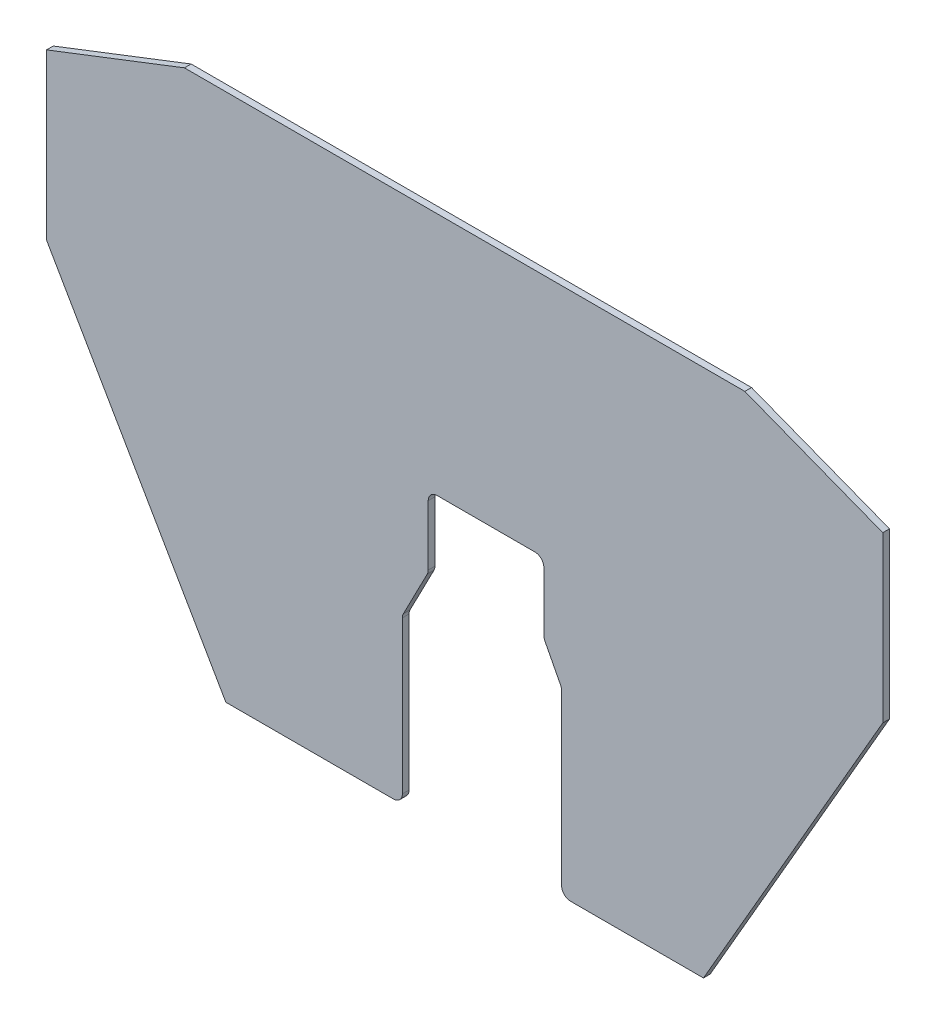
ISO-10303-21;
HEADER;
FILE_DESCRIPTION(('STEP AP214'),'2;1');
FILE_NAME('part.step','',(''),(''),'','','');
FILE_SCHEMA(('AUTOMOTIVE_DESIGN { 1 0 10303 214 1 1 1 1 }'));
ENDSEC;
DATA;
#1=APPLICATION_CONTEXT('core data for automotive mechanical design processes');
#2=APPLICATION_PROTOCOL_DEFINITION('international standard','automotive_design',2000,#1);
#3=PRODUCT_CONTEXT('',#1,'mechanical');
#4=PRODUCT('Part','Part','',(#3));
#5=PRODUCT_RELATED_PRODUCT_CATEGORY('part','',(#4));
#6=PRODUCT_DEFINITION_FORMATION('','',#4);
#7=PRODUCT_DEFINITION_CONTEXT('part definition',#1,'design');
#8=PRODUCT_DEFINITION('design','',#6,#7);
#9=PRODUCT_DEFINITION_SHAPE('','',#8);
#10=(LENGTH_UNIT() NAMED_UNIT(*) SI_UNIT(.MILLI.,.METRE.));
#11=(NAMED_UNIT(*) PLANE_ANGLE_UNIT() SI_UNIT($,.RADIAN.));
#12=(NAMED_UNIT(*) SI_UNIT($,.STERADIAN.) SOLID_ANGLE_UNIT());
#13=UNCERTAINTY_MEASURE_WITH_UNIT(LENGTH_MEASURE(1.E-05),#10,'distance_accuracy_value','');
#14=(GEOMETRIC_REPRESENTATION_CONTEXT(3) GLOBAL_UNCERTAINTY_ASSIGNED_CONTEXT((#13)) GLOBAL_UNIT_ASSIGNED_CONTEXT((#10,
#11,#12)) REPRESENTATION_CONTEXT('',''));
#15=CARTESIAN_POINT('',(0.,0.,0.));
#16=DIRECTION('',(0.,0.,1.));
#17=DIRECTION('',(1.,0.,0.));
#18=AXIS2_PLACEMENT_3D('',#15,#16,#17);
#19=CARTESIAN_POINT('',(-44.4499999999997,-171.615744817702,4.7752));
#20=DIRECTION('',(0.,1.,0.));
#21=DIRECTION('',(-1.,0.,0.));
#22=AXIS2_PLACEMENT_3D('',#19,#20,#21);
#23=PLANE('',#22);
#24=DIRECTION('',(1.,0.,0.));
#25=VECTOR('',#24,1.);
#26=CARTESIAN_POINT('',(-44.4499999999997,-171.615744817702,0.));
#27=LINE('',#26,#25);
#28=CARTESIAN_POINT('',(-170.467651581292,-171.615744817702,0.));
#29=VERTEX_POINT('',#28);
#30=CARTESIAN_POINT('',(-50.7999999999998,-171.615744817702,0.));
#31=VERTEX_POINT('',#30);
#32=EDGE_CURVE('E235',#29,#31,#27,.T.);
#33=ORIENTED_EDGE('',*,*,#32,.T.);
#34=DIRECTION('',(0.,0.,-1.));
#35=VECTOR('',#34,1.);
#36=CARTESIAN_POINT('',(-50.7999999999998,-171.615744817702,4.7752));
#37=LINE('',#36,#35);
#38=CARTESIAN_POINT('',(-50.7999999999998,-171.615744817702,4.7752));
#39=VERTEX_POINT('',#38);
#40=EDGE_CURVE('E343',#31,#39,#37,.F.);
#41=ORIENTED_EDGE('',*,*,#40,.T.);
#42=DIRECTION('',(1.,0.,0.));
#43=VECTOR('',#42,1.);
#44=CARTESIAN_POINT('',(-63.4999999999999,-171.615744817702,4.7752));
#45=LINE('',#44,#43);
#46=CARTESIAN_POINT('',(-170.467651581292,-171.615744817702,4.7752));
#47=VERTEX_POINT('',#46);
#48=EDGE_CURVE('E275',#47,#39,#45,.T.);
#49=ORIENTED_EDGE('',*,*,#48,.F.);
#50=DIRECTION('',(0.,0.,-1.));
#51=VECTOR('',#50,1.);
#52=CARTESIAN_POINT('',(-170.467651581292,-171.615744817702,4.7752));
#53=LINE('',#52,#51);
#54=EDGE_CURVE('E234',#47,#29,#53,.T.);
#55=ORIENTED_EDGE('',*,*,#54,.T.);
#56=EDGE_LOOP('',(#33,#41,#49,#55));
#57=FACE_BOUND('',#56,.T.);
#58=ADVANCED_FACE('F32',(#57),#23,.F.);
#59=CARTESIAN_POINT('',(-44.4499999999998,-54.8861606008071,4.7752));
#60=DIRECTION('',(-1.,0.,0.));
#61=DIRECTION('',(0.,-1.,0.));
#62=AXIS2_PLACEMENT_3D('',#59,#60,#61);
#63=PLANE('',#62);
#64=DIRECTION('',(0.,1.,0.));
#65=VECTOR('',#64,1.);
#66=CARTESIAN_POINT('',(-44.4499999999998,-54.8861606008071,0.));
#67=LINE('',#66,#65);
#68=CARTESIAN_POINT('',(-44.4499999999997,-165.265744817702,0.));
#69=VERTEX_POINT('',#68);
#70=CARTESIAN_POINT('',(-44.4499999999998,-56.4303886129366,0.));
#71=VERTEX_POINT('',#70);
#72=EDGE_CURVE('E238',#69,#71,#67,.T.);
#73=ORIENTED_EDGE('',*,*,#72,.T.);
#74=DIRECTION('',(0.,0.,-1.));
#75=VECTOR('',#74,1.);
#76=CARTESIAN_POINT('',(-44.4499999999998,-56.4303886129366,4.7752));
#77=LINE('',#76,#75);
#78=CARTESIAN_POINT('',(-44.4499999999998,-56.4303886129366,4.7752));
#79=VERTEX_POINT('',#78);
#80=EDGE_CURVE('E341',#71,#79,#77,.F.);
#81=ORIENTED_EDGE('',*,*,#80,.T.);
#82=DIRECTION('',(0.,1.,0.));
#83=VECTOR('',#82,1.);
#84=CARTESIAN_POINT('',(-44.4499999999998,-54.8861606008071,4.7752));
#85=LINE('',#84,#83);
#86=CARTESIAN_POINT('',(-44.4499999999997,-165.265744817702,4.7752));
#87=VERTEX_POINT('',#86);
#88=EDGE_CURVE('E374',#87,#79,#85,.T.);
#89=ORIENTED_EDGE('',*,*,#88,.F.);
#90=DIRECTION('',(0.,0.,-1.));
#91=VECTOR('',#90,1.);
#92=CARTESIAN_POINT('',(-44.4499999999997,-165.265744817702,4.7752));
#93=LINE('',#92,#91);
#94=EDGE_CURVE('E338',#87,#69,#93,.T.);
#95=ORIENTED_EDGE('',*,*,#94,.T.);
#96=EDGE_LOOP('',(#73,#81,#89,#95));
#97=FACE_BOUND('',#96,.T.);
#98=ADVANCED_FACE('F364',(#97),#63,.F.);
#99=CARTESIAN_POINT('',(-26.0104426662971,-19.215744817702,4.7752));
#100=DIRECTION('',(-0.888325926536994,0.45921351051792,0.));
#101=DIRECTION('',(-0.45921351051792,-0.888325926536994,0.));
#102=AXIS2_PLACEMENT_3D('',#99,#100,#101);
#103=PLANE('',#102);
#104=DIRECTION('',(0.45921351051792,0.888325926536994,0.));
#105=VECTOR('',#104,1.);
#106=CARTESIAN_POINT('',(-26.0104426662971,-19.215744817702,0.));
#107=LINE('',#106,#105);
#108=CARTESIAN_POINT('',(-43.7408696335097,-53.5143828211478,0.));
#109=VERTEX_POINT('',#108);
#110=CARTESIAN_POINT('',(-26.7195730327872,-20.5875225973613,0.));
#111=VERTEX_POINT('',#110);
#112=EDGE_CURVE('E241',#109,#111,#107,.T.);
#113=ORIENTED_EDGE('',*,*,#112,.T.);
#114=DIRECTION('',(0.,0.,-1.));
#115=VECTOR('',#114,1.);
#116=CARTESIAN_POINT('',(-26.7195730327872,-20.5875225973613,4.7752));
#117=LINE('',#116,#115);
#118=CARTESIAN_POINT('',(-26.7195730327872,-20.5875225973613,4.7752));
#119=VERTEX_POINT('',#118);
#120=EDGE_CURVE('E336',#111,#119,#117,.F.);
#121=ORIENTED_EDGE('',*,*,#120,.T.);
#122=DIRECTION('',(0.45921351051792,0.888325926536994,0.));
#123=VECTOR('',#122,1.);
#124=CARTESIAN_POINT('',(-26.0104426662971,-19.215744817702,4.7752));
#125=LINE('',#124,#123);
#126=CARTESIAN_POINT('',(-43.7408696335097,-53.5143828211478,4.7752));
#127=VERTEX_POINT('',#126);
#128=EDGE_CURVE('E372',#127,#119,#125,.T.);
#129=ORIENTED_EDGE('',*,*,#128,.F.);
#130=DIRECTION('',(0.,0.,-1.));
#131=VECTOR('',#130,1.);
#132=CARTESIAN_POINT('',(-43.7408696335097,-53.5143828211478,0.));
#133=LINE('',#132,#131);
#134=EDGE_CURVE('E333',#127,#109,#133,.T.);
#135=ORIENTED_EDGE('',*,*,#134,.T.);
#136=EDGE_LOOP('',(#113,#121,#129,#135));
#137=FACE_BOUND('',#136,.T.);
#138=ADVANCED_FACE('F376',(#137),#103,.F.);
#139=CARTESIAN_POINT('',(-26.0104426662971,31.5842551822979,4.7752));
#140=DIRECTION('',(-1.,0.,0.));
#141=DIRECTION('',(0.,-1.,0.));
#142=AXIS2_PLACEMENT_3D('',#139,#140,#141);
#143=PLANE('',#142);
#144=DIRECTION('',(0.,1.,0.));
#145=VECTOR('',#144,1.);
#146=CARTESIAN_POINT('',(-26.0104426662971,31.5842551822979,0.));
#147=LINE('',#146,#145);
#148=CARTESIAN_POINT('',(-26.0104426662971,-17.6715168055725,0.));
#149=VERTEX_POINT('',#148);
#150=CARTESIAN_POINT('',(-26.0104426662971,25.2342551822976,0.));
#151=VERTEX_POINT('',#150);
#152=EDGE_CURVE('E244',#149,#151,#147,.T.);
#153=ORIENTED_EDGE('',*,*,#152,.T.);
#154=DIRECTION('',(0.,0.,-1.));
#155=VECTOR('',#154,1.);
#156=CARTESIAN_POINT('',(-26.0104426662971,25.2342551822976,4.7752));
#157=LINE('',#156,#155);
#158=CARTESIAN_POINT('',(-26.0104426662971,25.2342551822976,4.7752));
#159=VERTEX_POINT('',#158);
#160=EDGE_CURVE('E331',#151,#159,#157,.F.);
#161=ORIENTED_EDGE('',*,*,#160,.T.);
#162=DIRECTION('',(0.,1.,0.));
#163=VECTOR('',#162,1.);
#164=CARTESIAN_POINT('',(-26.0104426662971,31.5842551822979,4.7752));
#165=LINE('',#164,#163);
#166=CARTESIAN_POINT('',(-26.0104426662971,-17.6715168055725,4.7752));
#167=VERTEX_POINT('',#166);
#168=EDGE_CURVE('E378',#167,#159,#165,.T.);
#169=ORIENTED_EDGE('',*,*,#168,.F.);
#170=DIRECTION('',(0.,0.,-1.));
#171=VECTOR('',#170,1.);
#172=CARTESIAN_POINT('',(-26.0104426662971,-17.6715168055725,4.7752));
#173=LINE('',#172,#171);
#174=EDGE_CURVE('E328',#167,#149,#173,.T.);
#175=ORIENTED_EDGE('',*,*,#174,.T.);
#176=EDGE_LOOP('',(#153,#161,#169,#175));
#177=FACE_BOUND('',#176,.T.);
#178=ADVANCED_FACE('F472',(#177),#143,.F.);
#179=CARTESIAN_POINT('',(50.8,31.5842551822979,4.7752));
#180=DIRECTION('',(0.,1.,0.));
#181=DIRECTION('',(-1.,0.,0.));
#182=AXIS2_PLACEMENT_3D('',#179,#180,#181);
#183=PLANE('',#182);
#184=DIRECTION('',(1.,0.,0.));
#185=VECTOR('',#184,1.);
#186=CARTESIAN_POINT('',(50.8,31.5842551822979,0.));
#187=LINE('',#186,#185);
#188=CARTESIAN_POINT('',(-19.6604426662971,31.5842551822977,0.));
#189=VERTEX_POINT('',#188);
#190=CARTESIAN_POINT('',(50.1895573337029,31.5842551822979,0.));
#191=VERTEX_POINT('',#190);
#192=EDGE_CURVE('E247',#189,#191,#187,.T.);
#193=ORIENTED_EDGE('',*,*,#192,.T.);
#194=DIRECTION('',(0.,0.,-1.));
#195=VECTOR('',#194,1.);
#196=CARTESIAN_POINT('',(50.1895573337029,31.5842551822979,4.7752));
#197=LINE('',#196,#195);
#198=CARTESIAN_POINT('',(50.1895573337029,31.5842551822979,4.7752));
#199=VERTEX_POINT('',#198);
#200=EDGE_CURVE('E326',#191,#199,#197,.F.);
#201=ORIENTED_EDGE('',*,*,#200,.T.);
#202=DIRECTION('',(1.,0.,0.));
#203=VECTOR('',#202,1.);
#204=CARTESIAN_POINT('',(50.8,31.5842551822979,4.7752));
#205=LINE('',#204,#203);
#206=CARTESIAN_POINT('',(-19.6604426662971,31.5842551822979,4.7752));
#207=VERTEX_POINT('',#206);
#208=EDGE_CURVE('E381',#207,#199,#205,.T.);
#209=ORIENTED_EDGE('',*,*,#208,.F.);
#210=DIRECTION('',(0.,0.,-1.));
#211=VECTOR('',#210,1.);
#212=CARTESIAN_POINT('',(-19.6604426662971,31.5842551822977,0.));
#213=LINE('',#212,#211);
#214=EDGE_CURVE('E323',#207,#189,#213,.T.);
#215=ORIENTED_EDGE('',*,*,#214,.T.);
#216=EDGE_LOOP('',(#193,#201,#209,#215));
#217=FACE_BOUND('',#216,.T.);
#218=ADVANCED_FACE('F479',(#217),#183,.F.);
#219=CARTESIAN_POINT('',(56.5395573337029,31.5842551822979,4.7752));
#220=DIRECTION('',(1.,0.,0.));
#221=DIRECTION('',(0.,0.,-1.));
#222=AXIS2_PLACEMENT_3D('',#219,#220,#221);
#223=PLANE('',#222);
#224=DIRECTION('',(0.,-1.,0.));
#225=VECTOR('',#224,1.);
#226=CARTESIAN_POINT('',(56.5395573337029,31.5842551822979,0.));
#227=LINE('',#226,#225);
#228=CARTESIAN_POINT('',(56.5395573337029,25.2342551822979,0.));
#229=VERTEX_POINT('',#228);
#230=CARTESIAN_POINT('',(56.5395573337029,-16.8994027995078,0.));
#231=VERTEX_POINT('',#230);
#232=EDGE_CURVE('E250',#229,#231,#227,.T.);
#233=ORIENTED_EDGE('',*,*,#232,.T.);
#234=DIRECTION('',(0.,0.,-1.));
#235=VECTOR('',#234,1.);
#236=CARTESIAN_POINT('',(56.5395573337029,-16.8994027995078,4.7752));
#237=LINE('',#236,#235);
#238=CARTESIAN_POINT('',(56.5395573337029,-16.8994027995078,4.7752));
#239=VERTEX_POINT('',#238);
#240=EDGE_CURVE('E321',#231,#239,#237,.F.);
#241=ORIENTED_EDGE('',*,*,#240,.T.);
#242=DIRECTION('',(0.,-1.,0.));
#243=VECTOR('',#242,1.);
#244=CARTESIAN_POINT('',(56.5395573337029,31.5842551822979,4.7752));
#245=LINE('',#244,#243);
#246=CARTESIAN_POINT('',(56.5395573337029,25.2342551822979,4.7752));
#247=VERTEX_POINT('',#246);
#248=EDGE_CURVE('E388',#247,#239,#245,.T.);
#249=ORIENTED_EDGE('',*,*,#248,.F.);
#250=DIRECTION('',(0.,0.,-1.));
#251=VECTOR('',#250,1.);
#252=CARTESIAN_POINT('',(56.5395573337029,25.2342551822979,0.));
#253=LINE('',#252,#251);
#254=EDGE_CURVE('E318',#247,#229,#253,.T.);
#255=ORIENTED_EDGE('',*,*,#254,.T.);
#256=EDGE_LOOP('',(#233,#241,#249,#255));
#257=FACE_BOUND('',#256,.T.);
#258=ADVANCED_FACE('F485',(#257),#223,.F.);
#259=CARTESIAN_POINT('',(56.5395573337029,-18.4436308116373,4.7752));
#260=DIRECTION('',(0.888325926536994,0.459213510517919,0.));
#261=DIRECTION('',(-0.459213510517919,0.888325926536994,0.));
#262=AXIS2_PLACEMENT_3D('',#259,#260,#261);
#263=PLANE('',#262);
#264=DIRECTION('',(0.459213510517919,-0.888325926536994,0.));
#265=VECTOR('',#264,1.);
#266=CARTESIAN_POINT('',(56.5395573337029,-18.4436308116373,0.));
#267=LINE('',#266,#265);
#268=CARTESIAN_POINT('',(57.248687700193,-19.8154085912966,0.));
#269=VERTEX_POINT('',#268);
#270=CARTESIAN_POINT('',(68.5304269672128,-41.6393777424244,0.));
#271=VERTEX_POINT('',#270);
#272=EDGE_CURVE('E253',#269,#271,#267,.T.);
#273=ORIENTED_EDGE('',*,*,#272,.T.);
#274=DIRECTION('',(0.,0.,-1.));
#275=VECTOR('',#274,1.);
#276=CARTESIAN_POINT('',(68.5304269672128,-41.6393777424244,4.7752));
#277=LINE('',#276,#275);
#278=CARTESIAN_POINT('',(68.5304269672128,-41.6393777424244,4.7752));
#279=VERTEX_POINT('',#278);
#280=EDGE_CURVE('E47',#271,#279,#277,.F.);
#281=ORIENTED_EDGE('',*,*,#280,.T.);
#282=DIRECTION('',(0.459213510517919,-0.888325926536994,0.));
#283=VECTOR('',#282,1.);
#284=CARTESIAN_POINT('',(56.5395573337029,-18.4436308116373,4.7752));
#285=LINE('',#284,#283);
#286=CARTESIAN_POINT('',(57.248687700193,-19.8154085912966,4.7752));
#287=VERTEX_POINT('',#286);
#288=EDGE_CURVE('E390',#287,#279,#285,.T.);
#289=ORIENTED_EDGE('',*,*,#288,.F.);
#290=DIRECTION('',(0.,0.,-1.));
#291=VECTOR('',#290,1.);
#292=CARTESIAN_POINT('',(57.248687700193,-19.8154085912966,4.7752));
#293=LINE('',#292,#291);
#294=EDGE_CURVE('E314',#287,#269,#293,.T.);
#295=ORIENTED_EDGE('',*,*,#294,.T.);
#296=EDGE_LOOP('',(#273,#281,#289,#295));
#297=FACE_BOUND('',#296,.T.);
#298=ADVANCED_FACE('F490',(#297),#263,.F.);
#299=CARTESIAN_POINT('',(69.2395573337029,-43.0111555220837,4.7752));
#300=DIRECTION('',(1.,0.,0.));
#301=DIRECTION('',(0.,0.,-1.));
#302=AXIS2_PLACEMENT_3D('',#299,#300,#301);
#303=PLANE('',#302);
#304=DIRECTION('',(0.,-1.,0.));
#305=VECTOR('',#304,1.);
#306=CARTESIAN_POINT('',(69.2395573337029,-43.0111555220837,0.));
#307=LINE('',#306,#305);
#308=CARTESIAN_POINT('',(69.2395573337029,-44.5553835342131,0.));
#309=VERTEX_POINT('',#308);
#310=CARTESIAN_POINT('',(69.2395573337029,-165.265744817702,0.));
#311=VERTEX_POINT('',#310);
#312=EDGE_CURVE('E255',#309,#311,#307,.T.);
#313=ORIENTED_EDGE('',*,*,#312,.T.);
#314=DIRECTION('',(0.,0.,-1.));
#315=VECTOR('',#314,1.);
#316=CARTESIAN_POINT('',(69.2395573337029,-165.265744817702,4.7752));
#317=LINE('',#316,#315);
#318=CARTESIAN_POINT('',(69.2395573337029,-165.265744817702,4.7752));
#319=VERTEX_POINT('',#318);
#320=EDGE_CURVE('E306',#311,#319,#317,.F.);
#321=ORIENTED_EDGE('',*,*,#320,.T.);
#322=DIRECTION('',(0.,-1.,0.));
#323=VECTOR('',#322,1.);
#324=CARTESIAN_POINT('',(69.2395573337029,-43.0111555220837,4.7752));
#325=LINE('',#324,#323);
#326=CARTESIAN_POINT('',(69.2395573337029,-44.5553835342131,4.7752));
#327=VERTEX_POINT('',#326);
#328=EDGE_CURVE('E204',#327,#319,#325,.T.);
#329=ORIENTED_EDGE('',*,*,#328,.F.);
#330=DIRECTION('',(0.,0.,-1.));
#331=VECTOR('',#330,1.);
#332=CARTESIAN_POINT('',(69.2395573337029,-44.5553835342131,0.));
#333=LINE('',#332,#331);
#334=EDGE_CURVE('E303',#327,#309,#333,.T.);
#335=ORIENTED_EDGE('',*,*,#334,.T.);
#336=EDGE_LOOP('',(#313,#321,#329,#335));
#337=FACE_BOUND('',#336,.T.);
#338=ADVANCED_FACE('F491',(#337),#303,.F.);
#339=CARTESIAN_POINT('',(170.467651581292,-171.615744817702,4.7752));
#340=DIRECTION('',(0.,1.,0.));
#341=DIRECTION('',(-1.,0.,0.));
#342=AXIS2_PLACEMENT_3D('',#339,#340,#341);
#343=PLANE('',#342);
#344=DIRECTION('',(1.,0.,0.));
#345=VECTOR('',#344,1.);
#346=CARTESIAN_POINT('',(170.467651581292,-171.615744817702,4.7752));
#347=LINE('',#346,#345);
#348=CARTESIAN_POINT('',(75.5895573337029,-171.615744817702,4.7752));
#349=VERTEX_POINT('',#348);
#350=CARTESIAN_POINT('',(170.467651581292,-171.615744817702,4.7752));
#351=VERTEX_POINT('',#350);
#352=EDGE_CURVE('E192',#349,#351,#347,.T.);
#353=ORIENTED_EDGE('',*,*,#352,.F.);
#354=DIRECTION('',(0.,0.,-1.));
#355=VECTOR('',#354,1.);
#356=CARTESIAN_POINT('',(75.5895573337029,-171.615744817702,4.7752));
#357=LINE('',#356,#355);
#358=CARTESIAN_POINT('',(75.5895573337029,-171.615744817702,0.));
#359=VERTEX_POINT('',#358);
#360=EDGE_CURVE('E213',#349,#359,#357,.T.);
#361=ORIENTED_EDGE('',*,*,#360,.T.);
#362=DIRECTION('',(1.,0.,0.));
#363=VECTOR('',#362,1.);
#364=CARTESIAN_POINT('',(170.467651581292,-171.615744817702,0.));
#365=LINE('',#364,#363);
#366=CARTESIAN_POINT('',(170.467651581292,-171.615744817702,0.));
#367=VERTEX_POINT('',#366);
#368=EDGE_CURVE('E210',#359,#367,#365,.T.);
#369=ORIENTED_EDGE('',*,*,#368,.T.);
#370=DIRECTION('',(0.,0.,-1.));
#371=VECTOR('',#370,1.);
#372=CARTESIAN_POINT('',(170.467651581292,-171.615744817702,4.7752));
#373=LINE('',#372,#371);
#374=EDGE_CURVE('E207',#351,#367,#373,.T.);
#375=ORIENTED_EDGE('',*,*,#374,.F.);
#376=EDGE_LOOP('',(#353,#361,#369,#375));
#377=FACE_BOUND('',#376,.T.);
#378=ADVANCED_FACE('F208',(#377),#343,.F.);
#379=CARTESIAN_POINT('',(170.467651581292,-171.615744817702,4.7752));
#380=DIRECTION('',(-0.86602540378444,0.499999999999998,0.));
#381=DIRECTION('',(-0.499999999999998,-0.86602540378444,0.));
#382=AXIS2_PLACEMENT_3D('',#379,#380,#381);
#383=PLANE('',#382);
#384=DIRECTION('',(0.499999999999998,0.86602540378444,0.));
#385=VECTOR('',#384,1.);
#386=CARTESIAN_POINT('',(170.467651581292,-171.615744817702,0.));
#387=LINE('',#386,#385);
#388=CARTESIAN_POINT('',(298.45,50.0561851154842,0.));
#389=VERTEX_POINT('',#388);
#390=EDGE_CURVE('E259',#367,#389,#387,.T.);
#391=ORIENTED_EDGE('',*,*,#390,.T.);
#392=DIRECTION('',(0.,0.,-1.));
#393=VECTOR('',#392,1.);
#394=CARTESIAN_POINT('',(298.45,50.0561851154842,4.7752));
#395=LINE('',#394,#393);
#396=CARTESIAN_POINT('',(298.45,50.0561851154842,4.7752));
#397=VERTEX_POINT('',#396);
#398=EDGE_CURVE('E214',#397,#389,#395,.T.);
#399=ORIENTED_EDGE('',*,*,#398,.F.);
#400=DIRECTION('',(0.499999999999998,0.86602540378444,0.));
#401=VECTOR('',#400,1.);
#402=CARTESIAN_POINT('',(170.467651581292,-171.615744817702,4.7752));
#403=LINE('',#402,#401);
#404=EDGE_CURVE('E197',#351,#397,#403,.T.);
#405=ORIENTED_EDGE('',*,*,#404,.F.);
#406=ORIENTED_EDGE('',*,*,#374,.T.);
#407=EDGE_LOOP('',(#391,#399,#405,#406));
#408=FACE_BOUND('',#407,.T.);
#409=ADVANCED_FACE('F216',(#408),#383,.F.);
#410=CARTESIAN_POINT('',(298.45,50.0561851154842,4.7752));
#411=DIRECTION('',(-1.,0.,0.));
#412=DIRECTION('',(0.,0.,1.));
#413=AXIS2_PLACEMENT_3D('',#410,#411,#412);
#414=PLANE('',#413);
#415=DIRECTION('',(0.,1.,0.));
#416=VECTOR('',#415,1.);
#417=CARTESIAN_POINT('',(298.45,50.0561851154842,0.));
#418=LINE('',#417,#416);
#419=CARTESIAN_POINT('',(298.45,167.681366782298,0.));
#420=VERTEX_POINT('',#419);
#421=EDGE_CURVE('E261',#389,#420,#418,.T.);
#422=ORIENTED_EDGE('',*,*,#421,.T.);
#423=DIRECTION('',(0.,0.,-1.));
#424=VECTOR('',#423,1.);
#425=CARTESIAN_POINT('',(298.45,167.681366782298,4.7752));
#426=LINE('',#425,#424);
#427=CARTESIAN_POINT('',(298.45,167.681366782298,4.7752));
#428=VERTEX_POINT('',#427);
#429=EDGE_CURVE('E290',#428,#420,#426,.T.);
#430=ORIENTED_EDGE('',*,*,#429,.F.);
#431=DIRECTION('',(0.,1.,0.));
#432=VECTOR('',#431,1.);
#433=CARTESIAN_POINT('',(298.45,50.0561851154842,4.7752));
#434=LINE('',#433,#432);
#435=EDGE_CURVE('E219',#397,#428,#434,.T.);
#436=ORIENTED_EDGE('',*,*,#435,.F.);
#437=ORIENTED_EDGE('',*,*,#398,.T.);
#438=EDGE_LOOP('',(#422,#430,#436,#437));
#439=FACE_BOUND('',#438,.T.);
#440=ADVANCED_FACE('F402',(#439),#414,.F.);
#441=CARTESIAN_POINT('',(298.45,167.681366782298,4.7752));
#442=DIRECTION('',(-0.360994102557712,-0.93256809827409,0.));
#443=DIRECTION('',(0.93256809827409,-0.360994102557712,0.));
#444=AXIS2_PLACEMENT_3D('',#441,#442,#443);
#445=PLANE('',#444);
#446=DIRECTION('',(-0.93256809827409,0.360994102557712,0.));
#447=VECTOR('',#446,1.);
#448=CARTESIAN_POINT('',(298.45,167.681366782298,0.));
#449=LINE('',#448,#447);
#450=CARTESIAN_POINT('',(200.025,205.781366782298,0.));
#451=VERTEX_POINT('',#450);
#452=EDGE_CURVE('E263',#420,#451,#449,.T.);
#453=ORIENTED_EDGE('',*,*,#452,.T.);
#454=DIRECTION('',(0.,0.,-1.));
#455=VECTOR('',#454,1.);
#456=CARTESIAN_POINT('',(200.025,205.781366782298,4.7752));
#457=LINE('',#456,#455);
#458=CARTESIAN_POINT('',(200.025,205.781366782298,4.7752));
#459=VERTEX_POINT('',#458);
#460=EDGE_CURVE('E287',#459,#451,#457,.T.);
#461=ORIENTED_EDGE('',*,*,#460,.F.);
#462=DIRECTION('',(-0.93256809827409,0.360994102557712,0.));
#463=VECTOR('',#462,1.);
#464=CARTESIAN_POINT('',(298.45,167.681366782298,4.7752));
#465=LINE('',#464,#463);
#466=EDGE_CURVE('E221',#428,#459,#465,.T.);
#467=ORIENTED_EDGE('',*,*,#466,.F.);
#468=ORIENTED_EDGE('',*,*,#429,.T.);
#469=EDGE_LOOP('',(#453,#461,#467,#468));
#470=FACE_BOUND('',#469,.T.);
#471=ADVANCED_FACE('F409',(#470),#445,.F.);
#472=CARTESIAN_POINT('',(-63.5,205.781366782298,4.7752));
#473=DIRECTION('',(0.,-1.,0.));
#474=DIRECTION('',(1.,0.,0.));
#475=AXIS2_PLACEMENT_3D('',#472,#473,#474);
#476=PLANE('',#475);
#477=DIRECTION('',(-1.,0.,0.));
#478=VECTOR('',#477,1.);
#479=CARTESIAN_POINT('',(-63.5,205.781366782298,0.));
#480=LINE('',#479,#478);
#481=CARTESIAN_POINT('',(-200.025,205.781366782298,0.));
#482=VERTEX_POINT('',#481);
#483=EDGE_CURVE('E266',#451,#482,#480,.T.);
#484=ORIENTED_EDGE('',*,*,#483,.T.);
#485=DIRECTION('',(0.,0.,-1.));
#486=VECTOR('',#485,1.);
#487=CARTESIAN_POINT('',(-200.025,205.781366782298,4.7752));
#488=LINE('',#487,#486);
#489=CARTESIAN_POINT('',(-200.025,205.781366782298,4.7752));
#490=VERTEX_POINT('',#489);
#491=EDGE_CURVE('E284',#490,#482,#488,.T.);
#492=ORIENTED_EDGE('',*,*,#491,.F.);
#493=DIRECTION('',(-1.,0.,0.));
#494=VECTOR('',#493,1.);
#495=CARTESIAN_POINT('',(200.025,205.781366782298,4.7752));
#496=LINE('',#495,#494);
#497=EDGE_CURVE('E226',#459,#490,#496,.T.);
#498=ORIENTED_EDGE('',*,*,#497,.F.);
#499=ORIENTED_EDGE('',*,*,#460,.T.);
#500=EDGE_LOOP('',(#484,#492,#498,#499));
#501=FACE_BOUND('',#500,.T.);
#502=ADVANCED_FACE('F411',(#501),#476,.F.);
#503=CARTESIAN_POINT('',(-298.45,167.681366782298,4.7752));
#504=DIRECTION('',(0.360994102557712,-0.932568098274089,0.));
#505=DIRECTION('',(0.93256809827409,0.360994102557712,0.));
#506=AXIS2_PLACEMENT_3D('',#503,#504,#505);
#507=PLANE('',#506);
#508=DIRECTION('',(-0.93256809827409,-0.360994102557712,0.));
#509=VECTOR('',#508,1.);
#510=CARTESIAN_POINT('',(-298.45,167.681366782298,0.));
#511=LINE('',#510,#509);
#512=CARTESIAN_POINT('',(-298.45,167.681366782298,0.));
#513=VERTEX_POINT('',#512);
#514=EDGE_CURVE('E268',#482,#513,#511,.T.);
#515=ORIENTED_EDGE('',*,*,#514,.T.);
#516=DIRECTION('',(0.,0.,-1.));
#517=VECTOR('',#516,1.);
#518=CARTESIAN_POINT('',(-298.45,167.681366782298,4.7752));
#519=LINE('',#518,#517);
#520=CARTESIAN_POINT('',(-298.45,167.681366782298,4.7752));
#521=VERTEX_POINT('',#520);
#522=EDGE_CURVE('E281',#521,#513,#519,.T.);
#523=ORIENTED_EDGE('',*,*,#522,.F.);
#524=DIRECTION('',(-0.93256809827409,-0.360994102557712,0.));
#525=VECTOR('',#524,1.);
#526=CARTESIAN_POINT('',(-298.45,167.681366782298,4.7752));
#527=LINE('',#526,#525);
#528=EDGE_CURVE('E228',#490,#521,#527,.T.);
#529=ORIENTED_EDGE('',*,*,#528,.F.);
#530=ORIENTED_EDGE('',*,*,#491,.T.);
#531=EDGE_LOOP('',(#515,#523,#529,#530));
#532=FACE_BOUND('',#531,.T.);
#533=ADVANCED_FACE('F416',(#532),#507,.F.);
#534=CARTESIAN_POINT('',(-298.45,50.056185115484,4.7752));
#535=DIRECTION('',(1.,0.,0.));
#536=DIRECTION('',(0.,0.,-1.));
#537=AXIS2_PLACEMENT_3D('',#534,#535,#536);
#538=PLANE('',#537);
#539=DIRECTION('',(0.,-1.,0.));
#540=VECTOR('',#539,1.);
#541=CARTESIAN_POINT('',(-298.45,50.056185115484,0.));
#542=LINE('',#541,#540);
#543=CARTESIAN_POINT('',(-298.45,50.056185115484,0.));
#544=VERTEX_POINT('',#543);
#545=EDGE_CURVE('E270',#513,#544,#542,.T.);
#546=ORIENTED_EDGE('',*,*,#545,.T.);
#547=DIRECTION('',(0.,0.,-1.));
#548=VECTOR('',#547,1.);
#549=CARTESIAN_POINT('',(-298.45,50.056185115484,4.7752));
#550=LINE('',#549,#548);
#551=CARTESIAN_POINT('',(-298.45,50.056185115484,4.7752));
#552=VERTEX_POINT('',#551);
#553=EDGE_CURVE('E278',#552,#544,#550,.T.);
#554=ORIENTED_EDGE('',*,*,#553,.F.);
#555=DIRECTION('',(0.,-1.,0.));
#556=VECTOR('',#555,1.);
#557=CARTESIAN_POINT('',(-298.45,50.056185115484,4.7752));
#558=LINE('',#557,#556);
#559=EDGE_CURVE('E230',#521,#552,#558,.T.);
#560=ORIENTED_EDGE('',*,*,#559,.F.);
#561=ORIENTED_EDGE('',*,*,#522,.T.);
#562=EDGE_LOOP('',(#546,#554,#560,#561));
#563=FACE_BOUND('',#562,.T.);
#564=ADVANCED_FACE('F423',(#563),#538,.F.);
#565=CARTESIAN_POINT('',(-170.467651581292,-171.615744817702,4.7752));
#566=DIRECTION('',(0.86602540378444,0.499999999999998,0.));
#567=DIRECTION('',(-0.499999999999998,0.86602540378444,0.));
#568=AXIS2_PLACEMENT_3D('',#565,#566,#567);
#569=PLANE('',#568);
#570=DIRECTION('',(0.499999999999998,-0.86602540378444,0.));
#571=VECTOR('',#570,1.);
#572=CARTESIAN_POINT('',(-170.467651581292,-171.615744817702,0.));
#573=LINE('',#572,#571);
#574=EDGE_CURVE('E272',#544,#29,#573,.T.);
#575=ORIENTED_EDGE('',*,*,#574,.T.);
#576=ORIENTED_EDGE('',*,*,#54,.F.);
#577=DIRECTION('',(0.499999999999998,-0.86602540378444,0.));
#578=VECTOR('',#577,1.);
#579=CARTESIAN_POINT('',(-170.467651581292,-171.615744817702,4.7752));
#580=LINE('',#579,#578);
#581=EDGE_CURVE('E232',#552,#47,#580,.T.);
#582=ORIENTED_EDGE('',*,*,#581,.F.);
#583=ORIENTED_EDGE('',*,*,#553,.T.);
#584=EDGE_LOOP('',(#575,#576,#582,#583));
#585=FACE_BOUND('',#584,.T.);
#586=ADVANCED_FACE('F427',(#585),#569,.F.);
#587=CARTESIAN_POINT('',(0.,0.,4.7752));
#588=DIRECTION('',(0.,0.,-1.));
#589=DIRECTION('',(-1.,0.,0.));
#590=AXIS2_PLACEMENT_3D('',#587,#588,#589);
#591=PLANE('',#590);
#592=ORIENTED_EDGE('',*,*,#328,.T.);
#593=CARTESIAN_POINT('',(75.5895573337029,-165.265744817702,4.7752));
#594=DIRECTION('',(0.,0.,-1.));
#595=DIRECTION('',(-1.,0.,0.));
#596=AXIS2_PLACEMENT_3D('',#593,#594,#595);
#597=CIRCLE('',#596,6.35);
#598=EDGE_CURVE('E200',#319,#349,#597,.F.);
#599=ORIENTED_EDGE('',*,*,#598,.T.);
#600=ORIENTED_EDGE('',*,*,#352,.T.);
#601=ORIENTED_EDGE('',*,*,#404,.T.);
#602=ORIENTED_EDGE('',*,*,#435,.T.);
#603=ORIENTED_EDGE('',*,*,#466,.T.);
#604=ORIENTED_EDGE('',*,*,#497,.T.);
#605=ORIENTED_EDGE('',*,*,#528,.T.);
#606=ORIENTED_EDGE('',*,*,#559,.T.);
#607=ORIENTED_EDGE('',*,*,#581,.T.);
#608=ORIENTED_EDGE('',*,*,#48,.T.);
#609=CARTESIAN_POINT('',(-50.7999999999997,-165.265744817702,4.7752));
#610=DIRECTION('',(0.,0.,-1.));
#611=DIRECTION('',(-1.,0.,0.));
#612=AXIS2_PLACEMENT_3D('',#609,#610,#611);
#613=CIRCLE('',#612,6.35);
#614=EDGE_CURVE('E308',#39,#87,#613,.F.);
#615=ORIENTED_EDGE('',*,*,#614,.T.);
#616=ORIENTED_EDGE('',*,*,#88,.T.);
#617=CARTESIAN_POINT('',(-38.0999999999998,-56.4303886129366,4.7752));
#618=DIRECTION('',(0.,0.,-1.));
#619=DIRECTION('',(-1.,0.,0.));
#620=AXIS2_PLACEMENT_3D('',#617,#618,#619);
#621=CIRCLE('',#620,6.35);
#622=EDGE_CURVE('E11',#79,#127,#621,.T.);
#623=ORIENTED_EDGE('',*,*,#622,.T.);
#624=ORIENTED_EDGE('',*,*,#128,.T.);
#625=CARTESIAN_POINT('',(-32.3604426662971,-17.6715168055725,4.7752));
#626=DIRECTION('',(0.,0.,-1.));
#627=DIRECTION('',(-1.,0.,0.));
#628=AXIS2_PLACEMENT_3D('',#625,#626,#627);
#629=CIRCLE('',#628,6.35);
#630=EDGE_CURVE('E310',#119,#167,#629,.F.);
#631=ORIENTED_EDGE('',*,*,#630,.T.);
#632=ORIENTED_EDGE('',*,*,#168,.T.);
#633=CARTESIAN_POINT('',(-19.6604426662971,25.2342551822977,4.7752));
#634=DIRECTION('',(0.,0.,-1.));
#635=DIRECTION('',(-1.,0.,0.));
#636=AXIS2_PLACEMENT_3D('',#633,#634,#635);
#637=CIRCLE('',#636,6.35);
#638=EDGE_CURVE('E355',#159,#207,#637,.T.);
#639=ORIENTED_EDGE('',*,*,#638,.T.);
#640=ORIENTED_EDGE('',*,*,#208,.T.);
#641=CARTESIAN_POINT('',(50.1895573337029,25.2342551822979,4.7752));
#642=DIRECTION('',(0.,0.,-1.));
#643=DIRECTION('',(-1.,0.,0.));
#644=AXIS2_PLACEMENT_3D('',#641,#642,#643);
#645=CIRCLE('',#644,6.35);
#646=EDGE_CURVE('E351',#199,#247,#645,.T.);
#647=ORIENTED_EDGE('',*,*,#646,.T.);
#648=ORIENTED_EDGE('',*,*,#248,.T.);
#649=CARTESIAN_POINT('',(62.8895573337029,-16.8994027995078,4.7752));
#650=DIRECTION('',(0.,0.,-1.));
#651=DIRECTION('',(-1.,0.,0.));
#652=AXIS2_PLACEMENT_3D('',#649,#650,#651);
#653=CIRCLE('',#652,6.35);
#654=EDGE_CURVE('E54',#239,#287,#653,.F.);
#655=ORIENTED_EDGE('',*,*,#654,.T.);
#656=ORIENTED_EDGE('',*,*,#288,.T.);
#657=CARTESIAN_POINT('',(62.8895573337029,-44.5553835342131,4.7752));
#658=DIRECTION('',(0.,0.,-1.));
#659=DIRECTION('',(-1.,0.,0.));
#660=AXIS2_PLACEMENT_3D('',#657,#658,#659);
#661=CIRCLE('',#660,6.35);
#662=EDGE_CURVE('E347',#279,#327,#661,.T.);
#663=ORIENTED_EDGE('',*,*,#662,.T.);
#664=EDGE_LOOP('',(#592,#599,#600,#601,#602,#603,#604,#605,#606,#607,#608,#615,#616,#623,#624,
#631,#632,#639,#640,#647,#648,#655,#656,#663));
#665=FACE_BOUND('',#664,.T.);
#666=ADVANCED_FACE('F195',(#665),#591,.F.);
#667=CARTESIAN_POINT('',(0.,0.,0.));
#668=DIRECTION('',(0.,0.,-1.));
#669=DIRECTION('',(-1.,0.,0.));
#670=AXIS2_PLACEMENT_3D('',#667,#668,#669);
#671=PLANE('',#670);
#672=ORIENTED_EDGE('',*,*,#368,.F.);
#673=CARTESIAN_POINT('',(75.5895573337029,-165.265744817702,0.));
#674=DIRECTION('',(0.,0.,-1.));
#675=DIRECTION('',(-1.,0.,0.));
#676=AXIS2_PLACEMENT_3D('',#673,#674,#675);
#677=CIRCLE('',#676,6.35);
#678=EDGE_CURVE('E301',#359,#311,#677,.T.);
#679=ORIENTED_EDGE('',*,*,#678,.T.);
#680=ORIENTED_EDGE('',*,*,#312,.F.);
#681=CARTESIAN_POINT('',(62.8895573337029,-44.5553835342131,0.));
#682=DIRECTION('',(0.,0.,-1.));
#683=DIRECTION('',(-1.,0.,0.));
#684=AXIS2_PLACEMENT_3D('',#681,#682,#683);
#685=CIRCLE('',#684,6.35);
#686=EDGE_CURVE('E345',#309,#271,#685,.F.);
#687=ORIENTED_EDGE('',*,*,#686,.T.);
#688=ORIENTED_EDGE('',*,*,#272,.F.);
#689=CARTESIAN_POINT('',(62.8895573337029,-16.8994027995078,0.));
#690=DIRECTION('',(0.,0.,-1.));
#691=DIRECTION('',(-1.,0.,0.));
#692=AXIS2_PLACEMENT_3D('',#689,#690,#691);
#693=CIRCLE('',#692,6.35);
#694=EDGE_CURVE('E299',#269,#231,#693,.T.);
#695=ORIENTED_EDGE('',*,*,#694,.T.);
#696=ORIENTED_EDGE('',*,*,#232,.F.);
#697=CARTESIAN_POINT('',(50.1895573337029,25.2342551822979,0.));
#698=DIRECTION('',(0.,0.,-1.));
#699=DIRECTION('',(-1.,0.,0.));
#700=AXIS2_PLACEMENT_3D('',#697,#698,#699);
#701=CIRCLE('',#700,6.35);
#702=EDGE_CURVE('E349',#229,#191,#701,.F.);
#703=ORIENTED_EDGE('',*,*,#702,.T.);
#704=ORIENTED_EDGE('',*,*,#192,.F.);
#705=CARTESIAN_POINT('',(-19.6604426662971,25.2342551822977,0.));
#706=DIRECTION('',(0.,0.,-1.));
#707=DIRECTION('',(-1.,0.,0.));
#708=AXIS2_PLACEMENT_3D('',#705,#706,#707);
#709=CIRCLE('',#708,6.35);
#710=EDGE_CURVE('E353',#189,#151,#709,.F.);
#711=ORIENTED_EDGE('',*,*,#710,.T.);
#712=ORIENTED_EDGE('',*,*,#152,.F.);
#713=CARTESIAN_POINT('',(-32.3604426662971,-17.6715168055725,0.));
#714=DIRECTION('',(0.,0.,-1.));
#715=DIRECTION('',(-1.,0.,0.));
#716=AXIS2_PLACEMENT_3D('',#713,#714,#715);
#717=CIRCLE('',#716,6.35);
#718=EDGE_CURVE('E297',#149,#111,#717,.T.);
#719=ORIENTED_EDGE('',*,*,#718,.T.);
#720=ORIENTED_EDGE('',*,*,#112,.F.);
#721=CARTESIAN_POINT('',(-38.0999999999998,-56.4303886129366,0.));
#722=DIRECTION('',(0.,0.,-1.));
#723=DIRECTION('',(-1.,0.,0.));
#724=AXIS2_PLACEMENT_3D('',#721,#722,#723);
#725=CIRCLE('',#724,6.35);
#726=EDGE_CURVE('E40',#109,#71,#725,.F.);
#727=ORIENTED_EDGE('',*,*,#726,.T.);
#728=ORIENTED_EDGE('',*,*,#72,.F.);
#729=CARTESIAN_POINT('',(-50.7999999999997,-165.265744817702,0.));
#730=DIRECTION('',(0.,0.,-1.));
#731=DIRECTION('',(-1.,0.,0.));
#732=AXIS2_PLACEMENT_3D('',#729,#730,#731);
#733=CIRCLE('',#732,6.35);
#734=EDGE_CURVE('E295',#69,#31,#733,.T.);
#735=ORIENTED_EDGE('',*,*,#734,.T.);
#736=ORIENTED_EDGE('',*,*,#32,.F.);
#737=ORIENTED_EDGE('',*,*,#574,.F.);
#738=ORIENTED_EDGE('',*,*,#545,.F.);
#739=ORIENTED_EDGE('',*,*,#514,.F.);
#740=ORIENTED_EDGE('',*,*,#483,.F.);
#741=ORIENTED_EDGE('',*,*,#452,.F.);
#742=ORIENTED_EDGE('',*,*,#421,.F.);
#743=ORIENTED_EDGE('',*,*,#390,.F.);
#744=EDGE_LOOP('',(#672,#679,#680,#687,#688,#695,#696,#703,#704,#711,#712,#719,#720,#727,#728,
#735,#736,#737,#738,#739,#740,#741,#742,#743));
#745=FACE_BOUND('',#744,.T.);
#746=ADVANCED_FACE('F359',(#745),#671,.T.);
#747=CARTESIAN_POINT('',(75.5895573337029,-165.265744817702,4.7752));
#748=DIRECTION('',(0.,0.,-1.));
#749=DIRECTION('',(-1.,0.,0.));
#750=AXIS2_PLACEMENT_3D('',#747,#748,#749);
#751=CYLINDRICAL_SURFACE('',#750,6.35);
#752=ORIENTED_EDGE('',*,*,#598,.F.);
#753=ORIENTED_EDGE('',*,*,#320,.F.);
#754=ORIENTED_EDGE('',*,*,#678,.F.);
#755=ORIENTED_EDGE('',*,*,#360,.F.);
#756=EDGE_LOOP('',(#752,#753,#754,#755));
#757=FACE_BOUND('',#756,.T.);
#758=ADVANCED_FACE('F397',(#757),#751,.T.);
#759=CARTESIAN_POINT('',(62.8895573337029,-44.5553835342131,4.7752));
#760=DIRECTION('',(0.,0.,1.));
#761=DIRECTION('',(1.,0.,0.));
#762=AXIS2_PLACEMENT_3D('',#759,#760,#761);
#763=CYLINDRICAL_SURFACE('',#762,6.35);
#764=ORIENTED_EDGE('',*,*,#662,.F.);
#765=ORIENTED_EDGE('',*,*,#280,.F.);
#766=ORIENTED_EDGE('',*,*,#686,.F.);
#767=ORIENTED_EDGE('',*,*,#334,.F.);
#768=EDGE_LOOP('',(#764,#765,#766,#767));
#769=FACE_BOUND('',#768,.T.);
#770=ADVANCED_FACE('F448',(#769),#763,.F.);
#771=CARTESIAN_POINT('',(62.8895573337029,-16.8994027995078,4.7752));
#772=DIRECTION('',(0.,0.,-1.));
#773=DIRECTION('',(-1.,0.,0.));
#774=AXIS2_PLACEMENT_3D('',#771,#772,#773);
#775=CYLINDRICAL_SURFACE('',#774,6.35);
#776=ORIENTED_EDGE('',*,*,#654,.F.);
#777=ORIENTED_EDGE('',*,*,#240,.F.);
#778=ORIENTED_EDGE('',*,*,#694,.F.);
#779=ORIENTED_EDGE('',*,*,#294,.F.);
#780=EDGE_LOOP('',(#776,#777,#778,#779));
#781=FACE_BOUND('',#780,.T.);
#782=ADVANCED_FACE('F451',(#781),#775,.T.);
#783=CARTESIAN_POINT('',(50.1895573337029,25.2342551822979,4.7752));
#784=DIRECTION('',(0.,0.,1.));
#785=DIRECTION('',(1.,0.,0.));
#786=AXIS2_PLACEMENT_3D('',#783,#784,#785);
#787=CYLINDRICAL_SURFACE('',#786,6.35);
#788=ORIENTED_EDGE('',*,*,#646,.F.);
#789=ORIENTED_EDGE('',*,*,#200,.F.);
#790=ORIENTED_EDGE('',*,*,#702,.F.);
#791=ORIENTED_EDGE('',*,*,#254,.F.);
#792=EDGE_LOOP('',(#788,#789,#790,#791));
#793=FACE_BOUND('',#792,.T.);
#794=ADVANCED_FACE('F455',(#793),#787,.F.);
#795=CARTESIAN_POINT('',(-19.6604426662971,25.2342551822977,4.7752));
#796=DIRECTION('',(0.,0.,1.));
#797=DIRECTION('',(1.,0.,0.));
#798=AXIS2_PLACEMENT_3D('',#795,#796,#797);
#799=CYLINDRICAL_SURFACE('',#798,6.35);
#800=ORIENTED_EDGE('',*,*,#638,.F.);
#801=ORIENTED_EDGE('',*,*,#160,.F.);
#802=ORIENTED_EDGE('',*,*,#710,.F.);
#803=ORIENTED_EDGE('',*,*,#214,.F.);
#804=EDGE_LOOP('',(#800,#801,#802,#803));
#805=FACE_BOUND('',#804,.T.);
#806=ADVANCED_FACE('F459',(#805),#799,.F.);
#807=CARTESIAN_POINT('',(-32.3604426662971,-17.6715168055725,4.7752));
#808=DIRECTION('',(0.,0.,-1.));
#809=DIRECTION('',(-1.,0.,0.));
#810=AXIS2_PLACEMENT_3D('',#807,#808,#809);
#811=CYLINDRICAL_SURFACE('',#810,6.35);
#812=ORIENTED_EDGE('',*,*,#630,.F.);
#813=ORIENTED_EDGE('',*,*,#120,.F.);
#814=ORIENTED_EDGE('',*,*,#718,.F.);
#815=ORIENTED_EDGE('',*,*,#174,.F.);
#816=EDGE_LOOP('',(#812,#813,#814,#815));
#817=FACE_BOUND('',#816,.T.);
#818=ADVANCED_FACE('F437',(#817),#811,.T.);
#819=CARTESIAN_POINT('',(-38.0999999999998,-56.4303886129366,4.7752));
#820=DIRECTION('',(0.,0.,1.));
#821=DIRECTION('',(1.,0.,0.));
#822=AXIS2_PLACEMENT_3D('',#819,#820,#821);
#823=CYLINDRICAL_SURFACE('',#822,6.35);
#824=ORIENTED_EDGE('',*,*,#622,.F.);
#825=ORIENTED_EDGE('',*,*,#80,.F.);
#826=ORIENTED_EDGE('',*,*,#726,.F.);
#827=ORIENTED_EDGE('',*,*,#134,.F.);
#828=EDGE_LOOP('',(#824,#825,#826,#827));
#829=FACE_BOUND('',#828,.T.);
#830=ADVANCED_FACE('F369',(#829),#823,.F.);
#831=CARTESIAN_POINT('',(-50.7999999999997,-165.265744817702,4.7752));
#832=DIRECTION('',(0.,0.,-1.));
#833=DIRECTION('',(-1.,0.,0.));
#834=AXIS2_PLACEMENT_3D('',#831,#832,#833);
#835=CYLINDRICAL_SURFACE('',#834,6.35);
#836=ORIENTED_EDGE('',*,*,#614,.F.);
#837=ORIENTED_EDGE('',*,*,#40,.F.);
#838=ORIENTED_EDGE('',*,*,#734,.F.);
#839=ORIENTED_EDGE('',*,*,#94,.F.);
#840=EDGE_LOOP('',(#836,#837,#838,#839));
#841=FACE_BOUND('',#840,.T.);
#842=ADVANCED_FACE('F34',(#841),#835,.T.);
#843=CLOSED_SHELL('',(#58,#98,#138,#178,#218,#258,#298,#338,#378,#409,#440,#471,#502,#533,#564,
#586,#666,#746,#758,#770,#782,#794,#806,#818,#830,#842));
#844=MANIFOLD_SOLID_BREP('B2',#843);
#845=ADVANCED_BREP_SHAPE_REPRESENTATION('',(#18,#844),#14);
#846=SHAPE_DEFINITION_REPRESENTATION(#9,#845);
ENDSEC;
END-ISO-10303-21;
